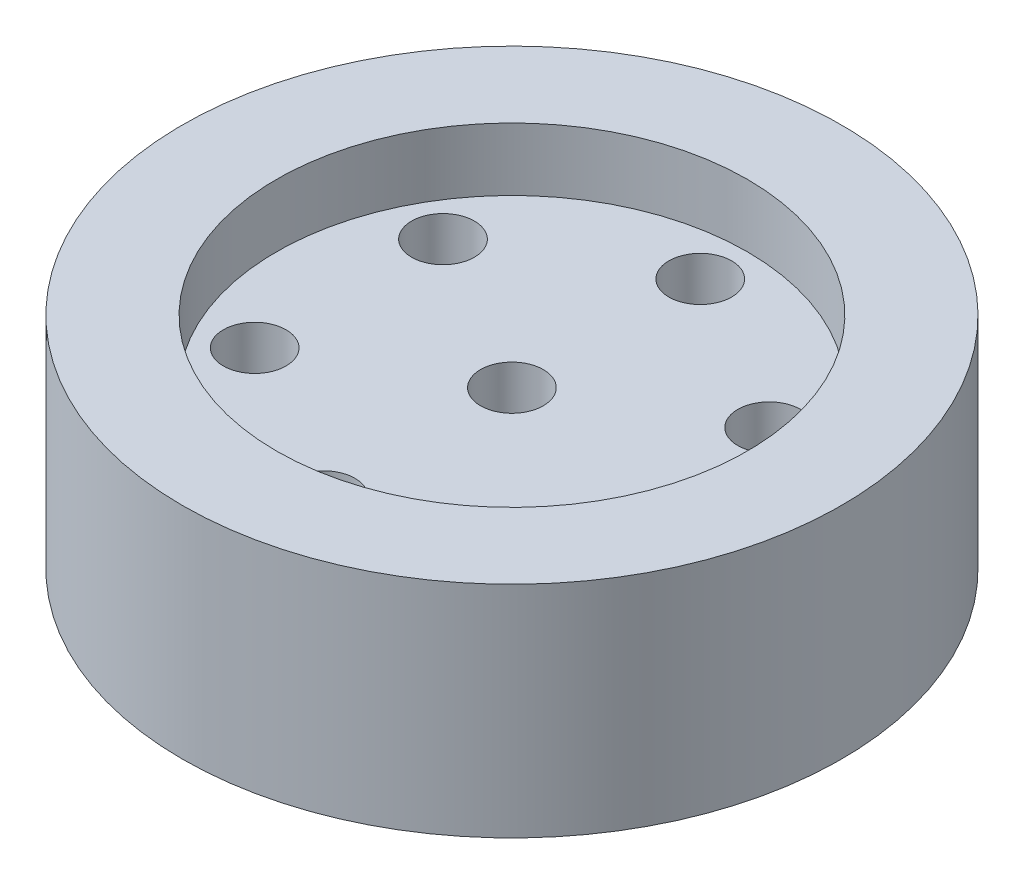
ISO-10303-21;
HEADER;
FILE_DESCRIPTION(('STEP AP214'),'2;1');
FILE_NAME('part.step','',(''),(''),'','','');
FILE_SCHEMA(('AUTOMOTIVE_DESIGN { 1 0 10303 214 1 1 1 1 }'));
ENDSEC;
DATA;
#1=APPLICATION_CONTEXT('core data for automotive mechanical design processes');
#2=APPLICATION_PROTOCOL_DEFINITION('international standard','automotive_design',2000,#1);
#3=PRODUCT_CONTEXT('',#1,'mechanical');
#4=PRODUCT('Part','Part','',(#3));
#5=PRODUCT_RELATED_PRODUCT_CATEGORY('part','',(#4));
#6=PRODUCT_DEFINITION_FORMATION('','',#4);
#7=PRODUCT_DEFINITION_CONTEXT('part definition',#1,'design');
#8=PRODUCT_DEFINITION('design','',#6,#7);
#9=PRODUCT_DEFINITION_SHAPE('','',#8);
#10=(LENGTH_UNIT() NAMED_UNIT(*) SI_UNIT(.MILLI.,.METRE.));
#11=(NAMED_UNIT(*) PLANE_ANGLE_UNIT() SI_UNIT($,.RADIAN.));
#12=(NAMED_UNIT(*) SI_UNIT($,.STERADIAN.) SOLID_ANGLE_UNIT());
#13=UNCERTAINTY_MEASURE_WITH_UNIT(LENGTH_MEASURE(1.E-05),#10,'distance_accuracy_value','');
#14=(GEOMETRIC_REPRESENTATION_CONTEXT(3) GLOBAL_UNCERTAINTY_ASSIGNED_CONTEXT((#13)) GLOBAL_UNIT_ASSIGNED_CONTEXT((#10,
#11,#12)) REPRESENTATION_CONTEXT('',''));
#15=CARTESIAN_POINT('',(0.,0.,0.));
#16=DIRECTION('',(0.,0.,1.));
#17=DIRECTION('',(1.,0.,0.));
#18=AXIS2_PLACEMENT_3D('',#15,#16,#17);
#19=CARTESIAN_POINT('',(0.,14.,0.));
#20=DIRECTION('',(0.,-1.,0.));
#21=DIRECTION('',(0.,0.,-1.));
#22=AXIS2_PLACEMENT_3D('',#19,#20,#21);
#23=CYLINDRICAL_SURFACE('',#22,21.);
#24=CARTESIAN_POINT('',(0.,14.,0.));
#25=DIRECTION('',(0.,1.,0.));
#26=DIRECTION('',(0.,0.,1.));
#27=AXIS2_PLACEMENT_3D('',#24,#25,#26);
#28=CIRCLE('',#27,21.);
#29=CARTESIAN_POINT('',(0.,14.,21.));
#30=VERTEX_POINT('',#29);
#31=EDGE_CURVE('E10',#30,#30,#28,.T.);
#32=ORIENTED_EDGE('',*,*,#31,.F.);
#33=EDGE_LOOP('',(#32));
#34=FACE_BOUND('',#33,.T.);
#35=CARTESIAN_POINT('',(0.,0.,0.));
#36=DIRECTION('',(0.,1.,0.));
#37=DIRECTION('',(0.,0.,1.));
#38=AXIS2_PLACEMENT_3D('',#35,#36,#37);
#39=CIRCLE('',#38,21.);
#40=CARTESIAN_POINT('',(0.,0.,21.));
#41=VERTEX_POINT('',#40);
#42=EDGE_CURVE('E46',#41,#41,#39,.T.);
#43=ORIENTED_EDGE('',*,*,#42,.T.);
#44=EDGE_LOOP('',(#43));
#45=FACE_BOUND('',#44,.T.);
#46=ADVANCED_FACE('F43',(#34,#45),#23,.T.);
#47=CARTESIAN_POINT('',(0.,14.,0.));
#48=DIRECTION('',(0.,1.,0.));
#49=DIRECTION('',(0.,0.,1.));
#50=AXIS2_PLACEMENT_3D('',#47,#48,#49);
#51=PLANE('',#50);
#52=CARTESIAN_POINT('',(0.,14.,0.));
#53=DIRECTION('',(0.,1.,0.));
#54=DIRECTION('',(0.,0.,1.));
#55=AXIS2_PLACEMENT_3D('',#52,#53,#54);
#56=CIRCLE('',#55,15.);
#57=CARTESIAN_POINT('',(0.,14.,15.));
#58=VERTEX_POINT('',#57);
#59=EDGE_CURVE('E57',#58,#58,#56,.T.);
#60=ORIENTED_EDGE('',*,*,#59,.F.);
#61=EDGE_LOOP('',(#60));
#62=FACE_BOUND('',#61,.T.);
#63=ORIENTED_EDGE('',*,*,#31,.T.);
#64=EDGE_LOOP('',(#63));
#65=FACE_BOUND('',#64,.T.);
#66=ADVANCED_FACE('F169',(#62,#65),#51,.T.);
#67=CARTESIAN_POINT('',(0.,0.,0.));
#68=DIRECTION('',(0.,1.,0.));
#69=DIRECTION('',(0.,0.,1.));
#70=AXIS2_PLACEMENT_3D('',#67,#68,#69);
#71=PLANE('',#70);
#72=CARTESIAN_POINT('',(0.,0.,0.));
#73=DIRECTION('',(0.,-1.,0.));
#74=DIRECTION('',(0.,0.,-1.));
#75=AXIS2_PLACEMENT_3D('',#72,#73,#74);
#76=CIRCLE('',#75,19.);
#77=CARTESIAN_POINT('',(0.,0.,-19.));
#78=VERTEX_POINT('',#77);
#79=EDGE_CURVE('E65',#78,#78,#76,.T.);
#80=ORIENTED_EDGE('',*,*,#79,.F.);
#81=EDGE_LOOP('',(#80));
#82=FACE_BOUND('',#81,.T.);
#83=ORIENTED_EDGE('',*,*,#42,.F.);
#84=EDGE_LOOP('',(#83));
#85=FACE_BOUND('',#84,.T.);
#86=ADVANCED_FACE('F165',(#82,#85),#71,.F.);
#87=CARTESIAN_POINT('',(0.,10.,0.));
#88=DIRECTION('',(0.,1.,0.));
#89=DIRECTION('',(0.,0.,1.));
#90=AXIS2_PLACEMENT_3D('',#87,#88,#89);
#91=CYLINDRICAL_SURFACE('',#90,15.);
#92=CARTESIAN_POINT('',(0.,10.,0.));
#93=DIRECTION('',(0.,1.,0.));
#94=DIRECTION('',(0.,0.,1.));
#95=AXIS2_PLACEMENT_3D('',#92,#93,#94);
#96=CIRCLE('',#95,15.);
#97=CARTESIAN_POINT('',(0.,10.,15.));
#98=VERTEX_POINT('',#97);
#99=EDGE_CURVE('E55',#98,#98,#96,.T.);
#100=ORIENTED_EDGE('',*,*,#99,.F.);
#101=EDGE_LOOP('',(#100));
#102=FACE_BOUND('',#101,.T.);
#103=ORIENTED_EDGE('',*,*,#59,.T.);
#104=EDGE_LOOP('',(#103));
#105=FACE_BOUND('',#104,.T.);
#106=ADVANCED_FACE('F168',(#102,#105),#91,.F.);
#107=CARTESIAN_POINT('',(0.,10.,0.));
#108=DIRECTION('',(0.,1.,0.));
#109=DIRECTION('',(0.,0.,1.));
#110=AXIS2_PLACEMENT_3D('',#107,#108,#109);
#111=PLANE('',#110);
#112=CARTESIAN_POINT('',(0.,10.,12.));
#113=DIRECTION('',(0.,1.,0.));
#114=DIRECTION('',(0.,0.,1.));
#115=AXIS2_PLACEMENT_3D('',#112,#113,#114);
#116=CIRCLE('',#115,2.);
#117=CARTESIAN_POINT('',(0.,10.,14.));
#118=VERTEX_POINT('',#117);
#119=EDGE_CURVE('E88',#118,#118,#116,.T.);
#120=ORIENTED_EDGE('',*,*,#119,.F.);
#121=EDGE_LOOP('',(#120));
#122=FACE_BOUND('',#121,.T.);
#123=CARTESIAN_POINT('',(-10.3923048454132,10.,6.00000000000012));
#124=DIRECTION('',(0.,1.,0.));
#125=DIRECTION('',(0.,0.,1.));
#126=AXIS2_PLACEMENT_3D('',#123,#124,#125);
#127=CIRCLE('',#126,2.);
#128=CARTESIAN_POINT('',(-10.3923048454132,10.,8.00000000000012));
#129=VERTEX_POINT('',#128);
#130=EDGE_CURVE('E92',#129,#129,#127,.T.);
#131=ORIENTED_EDGE('',*,*,#130,.F.);
#132=EDGE_LOOP('',(#131));
#133=FACE_BOUND('',#132,.T.);
#134=CARTESIAN_POINT('',(-10.3923048454133,10.,-5.99999999999991));
#135=DIRECTION('',(0.,1.,0.));
#136=DIRECTION('',(0.,0.,1.));
#137=AXIS2_PLACEMENT_3D('',#134,#135,#136);
#138=CIRCLE('',#137,2.);
#139=CARTESIAN_POINT('',(-10.3923048454133,10.,-3.99999999999991));
#140=VERTEX_POINT('',#139);
#141=EDGE_CURVE('E96',#140,#140,#138,.T.);
#142=ORIENTED_EDGE('',*,*,#141,.F.);
#143=EDGE_LOOP('',(#142));
#144=FACE_BOUND('',#143,.T.);
#145=CARTESIAN_POINT('',(0.,10.,-12.));
#146=DIRECTION('',(0.,1.,0.));
#147=DIRECTION('',(0.,0.,1.));
#148=AXIS2_PLACEMENT_3D('',#145,#146,#147);
#149=CIRCLE('',#148,2.);
#150=CARTESIAN_POINT('',(0.,10.,-10.));
#151=VERTEX_POINT('',#150);
#152=EDGE_CURVE('E100',#151,#151,#149,.T.);
#153=ORIENTED_EDGE('',*,*,#152,.F.);
#154=EDGE_LOOP('',(#153));
#155=FACE_BOUND('',#154,.T.);
#156=CARTESIAN_POINT('',(10.3923048454132,10.,-6.00000000000005));
#157=DIRECTION('',(0.,1.,0.));
#158=DIRECTION('',(0.,0.,1.));
#159=AXIS2_PLACEMENT_3D('',#156,#157,#158);
#160=CIRCLE('',#159,2.);
#161=CARTESIAN_POINT('',(10.3923048454132,10.,-4.00000000000005));
#162=VERTEX_POINT('',#161);
#163=EDGE_CURVE('E104',#162,#162,#160,.T.);
#164=ORIENTED_EDGE('',*,*,#163,.F.);
#165=EDGE_LOOP('',(#164));
#166=FACE_BOUND('',#165,.T.);
#167=CARTESIAN_POINT('',(10.3923048454133,10.,5.99999999999998));
#168=DIRECTION('',(0.,1.,0.));
#169=DIRECTION('',(0.,0.,1.));
#170=AXIS2_PLACEMENT_3D('',#167,#168,#169);
#171=CIRCLE('',#170,2.);
#172=CARTESIAN_POINT('',(10.3923048454133,10.,7.99999999999998));
#173=VERTEX_POINT('',#172);
#174=EDGE_CURVE('E108',#173,#173,#171,.T.);
#175=ORIENTED_EDGE('',*,*,#174,.F.);
#176=EDGE_LOOP('',(#175));
#177=FACE_BOUND('',#176,.T.);
#178=CARTESIAN_POINT('',(0.,10.,0.));
#179=DIRECTION('',(0.,1.,0.));
#180=DIRECTION('',(0.,0.,1.));
#181=AXIS2_PLACEMENT_3D('',#178,#179,#180);
#182=CIRCLE('',#181,2.);
#183=CARTESIAN_POINT('',(0.,10.,2.));
#184=VERTEX_POINT('',#183);
#185=EDGE_CURVE('E77',#184,#184,#182,.T.);
#186=ORIENTED_EDGE('',*,*,#185,.F.);
#187=EDGE_LOOP('',(#186));
#188=FACE_BOUND('',#187,.T.);
#189=ORIENTED_EDGE('',*,*,#99,.T.);
#190=EDGE_LOOP('',(#189));
#191=FACE_BOUND('',#190,.T.);
#192=ADVANCED_FACE('F161',(#122,#133,#144,#155,#166,#177,#188,#191),#111,.T.);
#193=CARTESIAN_POINT('',(0.,4.,0.));
#194=DIRECTION('',(0.,-1.,0.));
#195=DIRECTION('',(0.,0.,-1.));
#196=AXIS2_PLACEMENT_3D('',#193,#194,#195);
#197=CYLINDRICAL_SURFACE('',#196,19.);
#198=CARTESIAN_POINT('',(0.,4.,0.));
#199=DIRECTION('',(0.,-1.,0.));
#200=DIRECTION('',(0.,0.,-1.));
#201=AXIS2_PLACEMENT_3D('',#198,#199,#200);
#202=CIRCLE('',#201,19.);
#203=CARTESIAN_POINT('',(0.,4.,-19.));
#204=VERTEX_POINT('',#203);
#205=EDGE_CURVE('E61',#204,#204,#202,.T.);
#206=ORIENTED_EDGE('',*,*,#205,.F.);
#207=EDGE_LOOP('',(#206));
#208=FACE_BOUND('',#207,.T.);
#209=ORIENTED_EDGE('',*,*,#79,.T.);
#210=EDGE_LOOP('',(#209));
#211=FACE_BOUND('',#210,.T.);
#212=ADVANCED_FACE('F143',(#208,#211),#197,.F.);
#213=CARTESIAN_POINT('',(0.,4.,0.));
#214=DIRECTION('',(0.,-1.,0.));
#215=DIRECTION('',(0.,0.,-1.));
#216=AXIS2_PLACEMENT_3D('',#213,#214,#215);
#217=PLANE('',#216);
#218=CARTESIAN_POINT('',(0.,4.,12.));
#219=DIRECTION('',(0.,-1.,0.));
#220=DIRECTION('',(0.,0.,-1.));
#221=AXIS2_PLACEMENT_3D('',#218,#219,#220);
#222=CIRCLE('',#221,2.);
#223=CARTESIAN_POINT('',(0.,4.,10.));
#224=VERTEX_POINT('',#223);
#225=EDGE_CURVE('E112',#224,#224,#222,.T.);
#226=ORIENTED_EDGE('',*,*,#225,.F.);
#227=EDGE_LOOP('',(#226));
#228=FACE_BOUND('',#227,.T.);
#229=CARTESIAN_POINT('',(-10.3923048454132,4.,6.00000000000012));
#230=DIRECTION('',(0.,-1.,0.));
#231=DIRECTION('',(0.,0.,-1.));
#232=AXIS2_PLACEMENT_3D('',#229,#230,#231);
#233=CIRCLE('',#232,2.);
#234=CARTESIAN_POINT('',(-10.3923048454132,4.,4.00000000000012));
#235=VERTEX_POINT('',#234);
#236=EDGE_CURVE('E118',#235,#235,#233,.T.);
#237=ORIENTED_EDGE('',*,*,#236,.F.);
#238=EDGE_LOOP('',(#237));
#239=FACE_BOUND('',#238,.T.);
#240=CARTESIAN_POINT('',(-10.3923048454133,4.,-5.99999999999991));
#241=DIRECTION('',(0.,-1.,0.));
#242=DIRECTION('',(0.,0.,-1.));
#243=AXIS2_PLACEMENT_3D('',#240,#241,#242);
#244=CIRCLE('',#243,2.);
#245=CARTESIAN_POINT('',(-10.3923048454133,4.,-7.99999999999991));
#246=VERTEX_POINT('',#245);
#247=EDGE_CURVE('E113',#246,#246,#244,.T.);
#248=ORIENTED_EDGE('',*,*,#247,.F.);
#249=EDGE_LOOP('',(#248));
#250=FACE_BOUND('',#249,.T.);
#251=CARTESIAN_POINT('',(0.,4.,-12.));
#252=DIRECTION('',(0.,-1.,0.));
#253=DIRECTION('',(0.,0.,-1.));
#254=AXIS2_PLACEMENT_3D('',#251,#252,#253);
#255=CIRCLE('',#254,2.);
#256=CARTESIAN_POINT('',(0.,4.,-14.));
#257=VERTEX_POINT('',#256);
#258=EDGE_CURVE('E117',#257,#257,#255,.T.);
#259=ORIENTED_EDGE('',*,*,#258,.F.);
#260=EDGE_LOOP('',(#259));
#261=FACE_BOUND('',#260,.T.);
#262=CARTESIAN_POINT('',(10.3923048454132,4.,-6.00000000000005));
#263=DIRECTION('',(0.,-1.,0.));
#264=DIRECTION('',(0.,0.,-1.));
#265=AXIS2_PLACEMENT_3D('',#262,#263,#264);
#266=CIRCLE('',#265,2.);
#267=CARTESIAN_POINT('',(10.3923048454132,4.,-8.00000000000005));
#268=VERTEX_POINT('',#267);
#269=EDGE_CURVE('E122',#268,#268,#266,.T.);
#270=ORIENTED_EDGE('',*,*,#269,.F.);
#271=EDGE_LOOP('',(#270));
#272=FACE_BOUND('',#271,.T.);
#273=CARTESIAN_POINT('',(10.3923048454133,4.,5.99999999999998));
#274=DIRECTION('',(0.,-1.,0.));
#275=DIRECTION('',(0.,0.,-1.));
#276=AXIS2_PLACEMENT_3D('',#273,#274,#275);
#277=CIRCLE('',#276,2.);
#278=CARTESIAN_POINT('',(10.3923048454133,4.,3.99999999999997));
#279=VERTEX_POINT('',#278);
#280=EDGE_CURVE('E126',#279,#279,#277,.T.);
#281=ORIENTED_EDGE('',*,*,#280,.F.);
#282=EDGE_LOOP('',(#281));
#283=FACE_BOUND('',#282,.T.);
#284=CARTESIAN_POINT('',(0.,4.,0.));
#285=DIRECTION('',(0.,-1.,0.));
#286=DIRECTION('',(0.,0.,-1.));
#287=AXIS2_PLACEMENT_3D('',#284,#285,#286);
#288=CIRCLE('',#287,5.);
#289=CARTESIAN_POINT('',(0.,4.,-5.));
#290=VERTEX_POINT('',#289);
#291=EDGE_CURVE('E69',#290,#290,#288,.T.);
#292=ORIENTED_EDGE('',*,*,#291,.F.);
#293=EDGE_LOOP('',(#292));
#294=FACE_BOUND('',#293,.T.);
#295=ORIENTED_EDGE('',*,*,#205,.T.);
#296=EDGE_LOOP('',(#295));
#297=FACE_BOUND('',#296,.T.);
#298=ADVANCED_FACE('F139',(#228,#239,#250,#261,#272,#283,#294,#297),#217,.T.);
#299=CARTESIAN_POINT('',(0.,4.,0.));
#300=DIRECTION('',(0.,-1.,0.));
#301=DIRECTION('',(0.,0.,-1.));
#302=AXIS2_PLACEMENT_3D('',#299,#300,#301);
#303=CYLINDRICAL_SURFACE('',#302,5.);
#304=ORIENTED_EDGE('',*,*,#291,.T.);
#305=EDGE_LOOP('',(#304));
#306=FACE_BOUND('',#305,.T.);
#307=CARTESIAN_POINT('',(0.,0.,0.));
#308=DIRECTION('',(0.,-1.,0.));
#309=DIRECTION('',(0.,0.,-1.));
#310=AXIS2_PLACEMENT_3D('',#307,#308,#309);
#311=CIRCLE('',#310,5.);
#312=CARTESIAN_POINT('',(0.,0.,-5.));
#313=VERTEX_POINT('',#312);
#314=EDGE_CURVE('E73',#313,#313,#311,.T.);
#315=ORIENTED_EDGE('',*,*,#314,.F.);
#316=EDGE_LOOP('',(#315));
#317=FACE_BOUND('',#316,.T.);
#318=ADVANCED_FACE('F142',(#306,#317),#303,.T.);
#319=CARTESIAN_POINT('',(0.,0.,0.));
#320=DIRECTION('',(0.,-1.,0.));
#321=DIRECTION('',(0.,0.,-1.));
#322=AXIS2_PLACEMENT_3D('',#319,#320,#321);
#323=CIRCLE('',#322,2.);
#324=CARTESIAN_POINT('',(0.,0.,-2.));
#325=VERTEX_POINT('',#324);
#326=EDGE_CURVE('E84',#325,#325,#323,.T.);
#327=ORIENTED_EDGE('',*,*,#326,.F.);
#328=EDGE_LOOP('',(#327));
#329=FACE_BOUND('',#328,.T.);
#330=ORIENTED_EDGE('',*,*,#314,.T.);
#331=EDGE_LOOP('',(#330));
#332=FACE_BOUND('',#331,.T.);
#333=ADVANCED_FACE('F170',(#329,#332),#71,.F.);
#334=CARTESIAN_POINT('',(0.,14.,0.));
#335=DIRECTION('',(0.,-1.,0.));
#336=DIRECTION('',(0.,0.,-1.));
#337=AXIS2_PLACEMENT_3D('',#334,#335,#336);
#338=CYLINDRICAL_SURFACE('',#337,2.);
#339=ORIENTED_EDGE('',*,*,#185,.T.);
#340=EDGE_LOOP('',(#339));
#341=FACE_BOUND('',#340,.T.);
#342=ORIENTED_EDGE('',*,*,#326,.T.);
#343=EDGE_LOOP('',(#342));
#344=FACE_BOUND('',#343,.T.);
#345=ADVANCED_FACE('F193',(#341,#344),#338,.F.);
#346=CARTESIAN_POINT('',(10.3923048454133,14.,5.99999999999998));
#347=DIRECTION('',(0.,-1.,0.));
#348=DIRECTION('',(0.,0.,-1.));
#349=AXIS2_PLACEMENT_3D('',#346,#347,#348);
#350=CYLINDRICAL_SURFACE('',#349,2.);
#351=ORIENTED_EDGE('',*,*,#174,.T.);
#352=EDGE_LOOP('',(#351));
#353=FACE_BOUND('',#352,.T.);
#354=ORIENTED_EDGE('',*,*,#280,.T.);
#355=EDGE_LOOP('',(#354));
#356=FACE_BOUND('',#355,.T.);
#357=ADVANCED_FACE('F196',(#353,#356),#350,.F.);
#358=CARTESIAN_POINT('',(10.3923048454132,14.,-6.00000000000005));
#359=DIRECTION('',(0.,-1.,0.));
#360=DIRECTION('',(0.,0.,-1.));
#361=AXIS2_PLACEMENT_3D('',#358,#359,#360);
#362=CYLINDRICAL_SURFACE('',#361,2.);
#363=ORIENTED_EDGE('',*,*,#163,.T.);
#364=EDGE_LOOP('',(#363));
#365=FACE_BOUND('',#364,.T.);
#366=ORIENTED_EDGE('',*,*,#269,.T.);
#367=EDGE_LOOP('',(#366));
#368=FACE_BOUND('',#367,.T.);
#369=ADVANCED_FACE('F206',(#365,#368),#362,.F.);
#370=CARTESIAN_POINT('',(0.,14.,-12.));
#371=DIRECTION('',(0.,-1.,0.));
#372=DIRECTION('',(0.,0.,-1.));
#373=AXIS2_PLACEMENT_3D('',#370,#371,#372);
#374=CYLINDRICAL_SURFACE('',#373,2.);
#375=ORIENTED_EDGE('',*,*,#152,.T.);
#376=EDGE_LOOP('',(#375));
#377=FACE_BOUND('',#376,.T.);
#378=ORIENTED_EDGE('',*,*,#258,.T.);
#379=EDGE_LOOP('',(#378));
#380=FACE_BOUND('',#379,.T.);
#381=ADVANCED_FACE('F202',(#377,#380),#374,.F.);
#382=CARTESIAN_POINT('',(-10.3923048454133,14.,-5.99999999999991));
#383=DIRECTION('',(0.,-1.,0.));
#384=DIRECTION('',(0.,0.,-1.));
#385=AXIS2_PLACEMENT_3D('',#382,#383,#384);
#386=CYLINDRICAL_SURFACE('',#385,2.);
#387=ORIENTED_EDGE('',*,*,#141,.T.);
#388=EDGE_LOOP('',(#387));
#389=FACE_BOUND('',#388,.T.);
#390=ORIENTED_EDGE('',*,*,#247,.T.);
#391=EDGE_LOOP('',(#390));
#392=FACE_BOUND('',#391,.T.);
#393=ADVANCED_FACE('F198',(#389,#392),#386,.F.);
#394=CARTESIAN_POINT('',(-10.3923048454132,14.,6.00000000000012));
#395=DIRECTION('',(0.,-1.,0.));
#396=DIRECTION('',(0.,0.,-1.));
#397=AXIS2_PLACEMENT_3D('',#394,#395,#396);
#398=CYLINDRICAL_SURFACE('',#397,2.);
#399=ORIENTED_EDGE('',*,*,#130,.T.);
#400=EDGE_LOOP('',(#399));
#401=FACE_BOUND('',#400,.T.);
#402=ORIENTED_EDGE('',*,*,#236,.T.);
#403=EDGE_LOOP('',(#402));
#404=FACE_BOUND('',#403,.T.);
#405=ADVANCED_FACE('F201',(#401,#404),#398,.F.);
#406=CARTESIAN_POINT('',(0.,14.,12.));
#407=DIRECTION('',(0.,-1.,0.));
#408=DIRECTION('',(0.,0.,-1.));
#409=AXIS2_PLACEMENT_3D('',#406,#407,#408);
#410=CYLINDRICAL_SURFACE('',#409,2.);
#411=ORIENTED_EDGE('',*,*,#119,.T.);
#412=EDGE_LOOP('',(#411));
#413=FACE_BOUND('',#412,.T.);
#414=ORIENTED_EDGE('',*,*,#225,.T.);
#415=EDGE_LOOP('',(#414));
#416=FACE_BOUND('',#415,.T.);
#417=ADVANCED_FACE('F137',(#413,#416),#410,.F.);
#418=CLOSED_SHELL('',(#46,#66,#86,#106,#192,#212,#298,#318,#333,#345,#357,#369,#381,#393,#405,#417));
#419=MANIFOLD_SOLID_BREP('B2',#418);
#420=ADVANCED_BREP_SHAPE_REPRESENTATION('',(#18,#419),#14);
#421=SHAPE_DEFINITION_REPRESENTATION(#9,#420);
ENDSEC;
END-ISO-10303-21;
